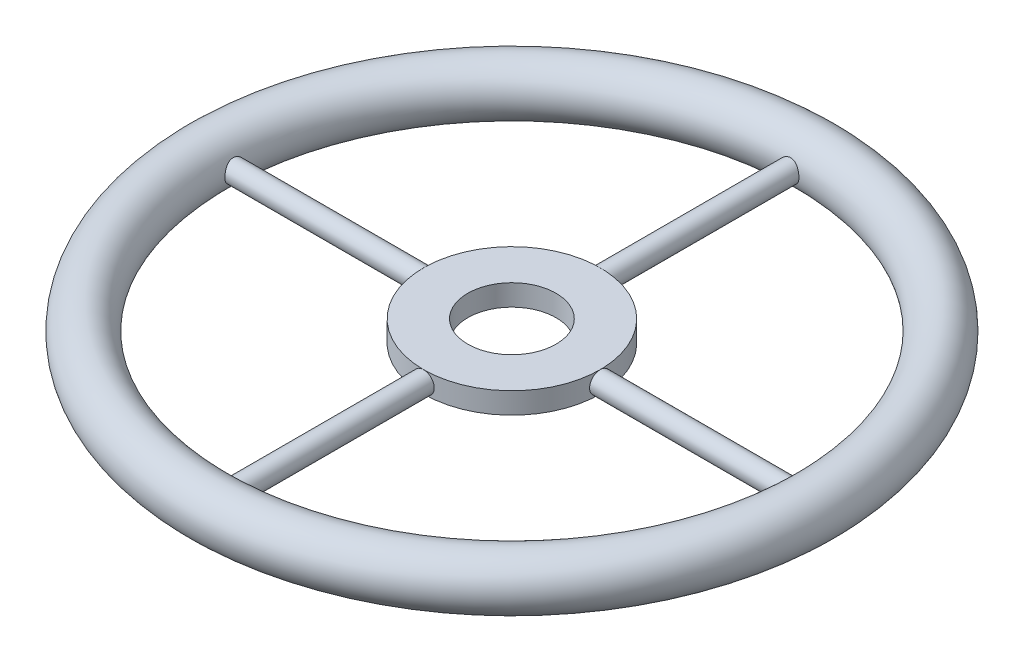
ISO-10303-21;
HEADER;
FILE_DESCRIPTION(('STEP AP214'),'2;1');
FILE_NAME('part.step','',(''),(''),'','','');
FILE_SCHEMA(('AUTOMOTIVE_DESIGN { 1 0 10303 214 1 1 1 1 }'));
ENDSEC;
DATA;
#1=APPLICATION_CONTEXT('core data for automotive mechanical design processes');
#2=APPLICATION_PROTOCOL_DEFINITION('international standard','automotive_design',2000,#1);
#3=PRODUCT_CONTEXT('',#1,'mechanical');
#4=PRODUCT('Part','Part','',(#3));
#5=PRODUCT_RELATED_PRODUCT_CATEGORY('part','',(#4));
#6=PRODUCT_DEFINITION_FORMATION('','',#4);
#7=PRODUCT_DEFINITION_CONTEXT('part definition',#1,'design');
#8=PRODUCT_DEFINITION('design','',#6,#7);
#9=PRODUCT_DEFINITION_SHAPE('','',#8);
#10=(LENGTH_UNIT() NAMED_UNIT(*) SI_UNIT(.MILLI.,.METRE.));
#11=(NAMED_UNIT(*) PLANE_ANGLE_UNIT() SI_UNIT($,.RADIAN.));
#12=(NAMED_UNIT(*) SI_UNIT($,.STERADIAN.) SOLID_ANGLE_UNIT());
#13=UNCERTAINTY_MEASURE_WITH_UNIT(LENGTH_MEASURE(1.E-05),#10,'distance_accuracy_value','');
#14=(GEOMETRIC_REPRESENTATION_CONTEXT(3) GLOBAL_UNCERTAINTY_ASSIGNED_CONTEXT((#13)) GLOBAL_UNIT_ASSIGNED_CONTEXT((#10,
#11,#12)) REPRESENTATION_CONTEXT('',''));
#15=CARTESIAN_POINT('',(0.,0.,0.));
#16=DIRECTION('',(0.,0.,1.));
#17=DIRECTION('',(1.,0.,0.));
#18=AXIS2_PLACEMENT_3D('',#15,#16,#17);
#19=CARTESIAN_POINT('',(0.,3.,0.));
#20=DIRECTION('',(0.,1.,0.));
#21=DIRECTION('',(0.,0.,1.));
#22=AXIS2_PLACEMENT_3D('',#19,#20,#21);
#23=PLANE('',#22);
#24=CARTESIAN_POINT('',(0.,3.,0.));
#25=DIRECTION('',(0.,1.,0.));
#26=DIRECTION('',(0.,0.,1.));
#27=AXIS2_PLACEMENT_3D('',#24,#25,#26);
#28=CIRCLE('',#27,25.);
#29=CARTESIAN_POINT('',(0.,3.,25.));
#30=VERTEX_POINT('',#29);
#31=EDGE_CURVE('E11',#30,#30,#28,.T.);
#32=ORIENTED_EDGE('',*,*,#31,.T.);
#33=EDGE_LOOP('',(#32));
#34=FACE_BOUND('',#33,.T.);
#35=CARTESIAN_POINT('',(0.,3.,0.));
#36=DIRECTION('',(0.,1.,0.));
#37=DIRECTION('',(0.,0.,1.));
#38=AXIS2_PLACEMENT_3D('',#35,#36,#37);
#39=CIRCLE('',#38,12.5);
#40=CARTESIAN_POINT('',(0.,3.,12.5));
#41=VERTEX_POINT('',#40);
#42=EDGE_CURVE('E51',#41,#41,#39,.T.);
#43=ORIENTED_EDGE('',*,*,#42,.F.);
#44=EDGE_LOOP('',(#43));
#45=FACE_BOUND('',#44,.T.);
#46=ADVANCED_FACE('F40',(#34,#45),#23,.T.);
#47=CARTESIAN_POINT('',(0.,-3.,0.));
#48=DIRECTION('',(0.,1.,0.));
#49=DIRECTION('',(0.,0.,1.));
#50=AXIS2_PLACEMENT_3D('',#47,#48,#49);
#51=PLANE('',#50);
#52=CARTESIAN_POINT('',(0.,-3.,0.));
#53=DIRECTION('',(0.,1.,0.));
#54=DIRECTION('',(0.,0.,1.));
#55=AXIS2_PLACEMENT_3D('',#52,#53,#54);
#56=CIRCLE('',#55,25.);
#57=CARTESIAN_POINT('',(0.,-3.,25.));
#58=VERTEX_POINT('',#57);
#59=EDGE_CURVE('E44',#58,#58,#56,.T.);
#60=ORIENTED_EDGE('',*,*,#59,.F.);
#61=EDGE_LOOP('',(#60));
#62=FACE_BOUND('',#61,.T.);
#63=CARTESIAN_POINT('',(0.,-3.,0.));
#64=DIRECTION('',(0.,1.,0.));
#65=DIRECTION('',(0.,0.,1.));
#66=AXIS2_PLACEMENT_3D('',#63,#64,#65);
#67=CIRCLE('',#66,12.5);
#68=CARTESIAN_POINT('',(0.,-3.,12.5));
#69=VERTEX_POINT('',#68);
#70=EDGE_CURVE('E53',#69,#69,#67,.T.);
#71=ORIENTED_EDGE('',*,*,#70,.T.);
#72=EDGE_LOOP('',(#71));
#73=FACE_BOUND('',#72,.T.);
#74=ADVANCED_FACE('F63',(#62,#73),#51,.F.);
#75=CARTESIAN_POINT('',(0.,3.,0.));
#76=DIRECTION('',(0.,-1.,0.));
#77=DIRECTION('',(0.,0.,-1.));
#78=AXIS2_PLACEMENT_3D('',#75,#76,#77);
#79=CYLINDRICAL_SURFACE('',#78,25.);
#80=ORIENTED_EDGE('',*,*,#59,.T.);
#81=EDGE_LOOP('',(#80));
#82=FACE_BOUND('',#81,.T.);
#83=ORIENTED_EDGE('',*,*,#31,.F.);
#84=EDGE_LOOP('',(#83));
#85=FACE_BOUND('',#84,.T.);
#86=ADVANCED_FACE('F42',(#82,#85),#79,.T.);
#87=CARTESIAN_POINT('',(0.,3.,0.));
#88=DIRECTION('',(0.,-1.,0.));
#89=DIRECTION('',(0.,0.,-1.));
#90=AXIS2_PLACEMENT_3D('',#87,#88,#89);
#91=CYLINDRICAL_SURFACE('',#90,12.5);
#92=ORIENTED_EDGE('',*,*,#42,.T.);
#93=EDGE_LOOP('',(#92));
#94=FACE_BOUND('',#93,.T.);
#95=ORIENTED_EDGE('',*,*,#70,.F.);
#96=EDGE_LOOP('',(#95));
#97=FACE_BOUND('',#96,.T.);
#98=ADVANCED_FACE('F59',(#94,#97),#91,.F.);
#99=CLOSED_SHELL('',(#46,#74,#86,#98));
#100=MANIFOLD_SOLID_BREP('B2',#99);
#101=CARTESIAN_POINT('',(0.,0.,0.));
#102=DIRECTION('',(0.,1.,0.));
#103=DIRECTION('',(0.,0.,1.));
#104=AXIS2_PLACEMENT_3D('',#101,#102,#103);
#105=TOROIDAL_SURFACE('',#104,85.8476638283119,7.5);
#106=CARTESIAN_POINT('',(78.5618686561057,-1.91339077582563,-2.3106142137616));
#107=CARTESIAN_POINT('',(78.5995124751979,-2.04393674965702,-2.2024992142221));
#108=CARTESIAN_POINT('',(78.638591819974,-2.16522498624866,-2.08338323229612));
#109=CARTESIAN_POINT('',(78.7154383525312,-2.38641971132747,-1.82590455223503));
#110=CARTESIAN_POINT('',(78.7532018439047,-2.48626948787211,-1.68749236447009));
#111=CARTESIAN_POINT('',(78.8230692540053,-2.661765396633,-1.39434747518503));
#112=CARTESIAN_POINT('',(78.8551631593777,-2.73736889444155,-1.23958665455772));
#113=CARTESIAN_POINT('',(78.9094082721015,-2.86127809993714,-0.91799346306707));
#114=CARTESIAN_POINT('',(78.9315722924355,-2.90961900676459,-0.75117697302815));
#115=CARTESIAN_POINT('',(78.9618888732425,-2.97496781791361,-0.420033006944285));
#116=CARTESIAN_POINT('',(78.9707564121175,-2.99357842037604,-0.256089062158436));
#117=CARTESIAN_POINT('',(78.9755161780428,-3.0036216625241,0.0728101053366255));
#118=CARTESIAN_POINT('',(78.9714115757815,-2.99506094350034,0.237765071092576));
#119=CARTESIAN_POINT('',(78.9515515818405,-2.95274266632924,0.552016400852583));
#120=CARTESIAN_POINT('',(78.9366160840533,-2.92075677724214,0.701609910119406));
#121=CARTESIAN_POINT('',(78.897818935931,-2.83491864760548,0.993146830242615));
#122=CARTESIAN_POINT('',(78.8739554044755,-2.78106179868006,1.13508862168012));
#123=CARTESIAN_POINT('',(78.8187214075257,-2.6505394203824,1.41397963718226));
#124=CARTESIAN_POINT('',(78.7870779631489,-2.57301165123146,1.55046945511017));
#125=CARTESIAN_POINT('',(78.7201390313756,-2.39819070750078,1.80916551437246));
#126=CARTESIAN_POINT('',(78.6848418779664,-2.30088849654865,1.93136518514014));
#127=CARTESIAN_POINT('',(78.6108015989089,-2.0792230837355,2.16922113311402));
#128=CARTESIAN_POINT('',(78.5720283296728,-1.95323288376062,2.28335770455394));
#129=CARTESIAN_POINT('',(78.4982384949839,-1.68306791658934,2.48920098955542));
#130=CARTESIAN_POINT('',(78.4632224234013,-1.53889076418863,2.58090475642738));
#131=CARTESIAN_POINT('',(78.4005212335877,-1.23451407238422,2.73964287062057));
#132=CARTESIAN_POINT('',(78.3728950986675,-1.07419890484202,2.80648030570281));
#133=CARTESIAN_POINT('',(78.328626248943,-0.743073509781658,2.91169431878434));
#134=CARTESIAN_POINT('',(78.3119761191103,-0.572270452983933,2.95009011319498));
#135=CARTESIAN_POINT('',(78.2924983955039,-0.238924403694177,2.99483497718549));
#136=CARTESIAN_POINT('',(78.2887228081595,-0.0767303151223625,3.00338308866935));
#137=CARTESIAN_POINT('',(78.2927466810367,0.246747681492072,2.99420760268051));
#138=CARTESIAN_POINT('',(78.3005437925712,0.408031767552397,2.97648933598755));
#139=CARTESIAN_POINT('',(78.3262761523617,0.71806209147178,2.91689312606649));
#140=CARTESIAN_POINT('',(78.3437697827291,0.867050215003399,2.87606604434791));
#141=CARTESIAN_POINT('',(78.3868481885834,1.15597944373606,2.77259317752849));
#142=CARTESIAN_POINT('',(78.4124344351102,1.29591889853564,2.70994342538961));
#143=CARTESIAN_POINT('',(78.4707078196434,1.57009820581867,2.56129917872123));
#144=CARTESIAN_POINT('',(78.5036739417856,1.70375394084042,2.47433931917144));
#145=CARTESIAN_POINT('',(78.5727981220403,1.95519058047933,2.28088149722203));
#146=CARTESIAN_POINT('',(78.6089577560932,2.07296357399083,2.17437386008152));
#147=CARTESIAN_POINT('',(78.6838264320591,2.29855737396736,1.93536420012576));
#148=CARTESIAN_POINT('',(78.7225213135003,2.4049504897437,1.80150495178622));
#149=CARTESIAN_POINT('',(78.7953378256346,2.59395906161232,1.51676316531546));
#150=CARTESIAN_POINT('',(78.8294592062043,2.67657321752332,1.36587969696493));
#151=CARTESIAN_POINT('',(78.888775324316,2.81507485256404,1.05110226981276));
#152=CARTESIAN_POINT('',(78.913994688711,2.87103621733115,0.887245764354306));
#153=CARTESIAN_POINT('',(78.9520236447146,2.95402789382665,0.551026881729346));
#154=CARTESIAN_POINT('',(78.9648443142742,2.98108403398154,0.378672242455212));
#155=CARTESIAN_POINT('',(78.9756107357453,3.00383269863051,0.0467718495112792));
#156=CARTESIAN_POINT('',(78.9747682501717,3.00208002665547,-0.112563515325449));
#157=CARTESIAN_POINT('',(78.9612649877136,2.97347975748081,-0.428440427864999));
#158=CARTESIAN_POINT('',(78.9486045632573,2.94663290862612,-0.58498205873917));
#159=CARTESIAN_POINT('',(78.9136932868741,2.87030746497312,-0.88580984417429));
#160=CARTESIAN_POINT('',(78.891764570547,2.82158590947409,-1.03032835755258));
#161=CARTESIAN_POINT('',(78.8408248291199,2.70346297550031,-1.30929443868641));
#162=CARTESIAN_POINT('',(78.8118117181834,2.63405550520526,-1.44373902514323));
#163=CARTESIAN_POINT('',(78.7472421043279,2.47053292600287,-1.70956128675353));
#164=CARTESIAN_POINT('',(78.7113590631349,2.37496177289715,-1.83996338490581));
#165=CARTESIAN_POINT('',(78.6383918883654,2.16434973148672,-2.08363841502114));
#166=CARTESIAN_POINT('',(78.6013071804828,2.04929941923749,-2.19690300545561));
#167=CARTESIAN_POINT('',(78.5270434670328,1.79345436307324,-2.41106470011811));
#168=CARTESIAN_POINT('',(78.490036677455,1.65142679520605,-2.51055716100987));
#169=CARTESIAN_POINT('',(78.4229073232578,1.35110844063152,-2.6841307189476));
#170=CARTESIAN_POINT('',(78.392783048118,1.19282170904284,-2.75821813224132));
#171=CARTESIAN_POINT('',(78.3437700652401,0.869629144271727,-2.87617000365357));
#172=CARTESIAN_POINT('',(78.3245475868581,0.705106412691055,-2.92093964009821));
#173=CARTESIAN_POINT('',(78.2981586179533,0.369961173572077,-2.98196047298577));
#174=CARTESIAN_POINT('',(78.2909837032634,0.199343013543308,-2.99823159713927));
#175=CARTESIAN_POINT('',(78.2896041546164,-0.128970389126099,-3.00136983028685));
#176=CARTESIAN_POINT('',(78.2944402517421,-0.286645603629565,-2.99041159856704));
#177=CARTESIAN_POINT('',(78.314582685326,-0.597736743870893,-2.94405281385859));
#178=CARTESIAN_POINT('',(78.3298939975215,-0.751150609411467,-2.90864064515156));
#179=CARTESIAN_POINT('',(78.3692630588409,-1.04835418381051,-2.81515035211971));
#180=CARTESIAN_POINT('',(78.3932544648431,-1.19220734931058,-2.75724391353834));
#181=CARTESIAN_POINT('',(78.4476928685678,-1.46812046058587,-2.62073489704594));
#182=CARTESIAN_POINT('',(78.4781286367383,-1.60020036008252,-2.54216826344566));
#183=CARTESIAN_POINT('',(78.5271275525521,-1.78982535990857,-2.4089015514564));
#184=CARTESIAN_POINT('',(78.5443425199543,-1.85261143497863,-2.36095018518092));
#185=CARTESIAN_POINT('',(78.5618686561057,-1.91339077582563,-2.3106142137616));
#186=B_SPLINE_CURVE_WITH_KNOTS('',3,(#106,#107,#108,#109,#110,#111,#112,#113,#114,#115,#116,
#117,#118,#119,#120,#121,#122,#123,#124,#125,#126,#127,#128,#129,#130,#131,#132,#133,#134,#135,
#136,#137,#138,#139,#140,#141,#142,#143,#144,#145,#146,#147,#148,#149,#150,#151,#152,#153,#154,
#155,#156,#157,#158,#159,#160,#161,#162,#163,#164,#165,#166,#167,#168,#169,#170,#171,#172,#173,
#174,#175,#176,#177,#178,#179,#180,#181,#182,#183,#184,#185),.UNSPECIFIED.,.T.,.F.,(4,2,2,2,2,2,
2,2,2,2,2,2,2,2,2,2,2,2,2,2,2,2,2,2,2,2,2,2,2,2,2,2,2,2,2,2,2,2,2,4),(0.,0.520667334552099,
1.04269548755042,1.56563659960743,2.08790097968811,2.58092566555643,3.07382985422919,
3.5328669971611,3.99200091290158,4.47040034270268,4.94901888136745,5.46971442257616,
5.99047832372723,6.51528246186012,7.03973169523005,7.52461737971955,8.00940466979305,
8.47373828691227,8.93815635709032,9.424576723299,9.91123848492748,10.4347302617316,
10.9582506564809,11.4803112009613,12.001904864123,12.4775134075935,12.9531077681764,
13.4133789866484,13.8737858851126,14.3685108535881,14.8634758556807,15.3928058196497,
15.9220040850891,16.43397867761,16.9455951264944,17.4176835336181,17.8899963390213,
18.3587729242251,18.8267392733815,19.0691505593513),.UNSPECIFIED.);
#187=CARTESIAN_POINT('',(78.5618686561057,-1.91339077582563,-2.3106142137616));
#188=VERTEX_POINT('',#187);
#189=EDGE_CURVE('E120',#188,#188,#186,.T.);
#190=ORIENTED_EDGE('',*,*,#189,.F.);
#191=EDGE_LOOP('',(#190));
#192=FACE_BOUND('',#191,.T.);
#193=CARTESIAN_POINT('',(-2.51316678519638,-1.63829327725293,-78.4885574861029));
#194=CARTESIAN_POINT('',(-2.41934447941206,-1.78220149518015,-78.5237965211951));
#195=CARTESIAN_POINT('',(-2.31332251364395,-1.91775759379407,-78.5618651726387));
#196=CARTESIAN_POINT('',(-2.07976672415185,-2.16889966871946,-78.6395152614662));
#197=CARTESIAN_POINT('',(-1.95217006165346,-2.28442525367376,-78.6791008488618));
#198=CARTESIAN_POINT('',(-1.67850465366882,-2.49241482169713,-78.755303328163));
#199=CARTESIAN_POINT('',(-1.53243410859537,-2.58487655544705,-78.7919199302814));
#200=CARTESIAN_POINT('',(-1.22535107106869,-2.74378378131106,-78.8576844150814));
#201=CARTESIAN_POINT('',(-1.06435548554183,-2.8102582765558,-78.8868406113373));
#202=CARTESIAN_POINT('',(-0.737367544923731,-2.91283796032252,-78.932916406295));
#203=CARTESIAN_POINT('',(-0.571732070160122,-2.94990028521982,-78.9502189098082));
#204=CARTESIAN_POINT('',(-0.23576196369973,-2.99551420262397,-78.9716229316137));
#205=CARTESIAN_POINT('',(-0.0654300057831522,-3.0040816930326,-78.9757318108781));
#206=CARTESIAN_POINT('',(0.259181179223377,-2.99280680438401,-78.9703927467513));
#207=CARTESIAN_POINT('',(0.413570065983336,-2.97536663994517,-78.9620909539538));
#208=CARTESIAN_POINT('',(0.716925754373804,-2.9171692488975,-78.9350598107687));
#209=CARTESIAN_POINT('',(0.865891873569792,-2.87640909827353,-78.9163291527484));
#210=CARTESIAN_POINT('',(1.15550493170679,-2.77283473905363,-78.8705106175926));
#211=CARTESIAN_POINT('',(1.29609898960417,-2.7098948079036,-78.8433752079038));
#212=CARTESIAN_POINT('',(1.56517031682369,-2.56392145464633,-78.7836615419636));
#213=CARTESIAN_POINT('',(1.6936430297575,-2.48088051810469,-78.7510812516453));
#214=CARTESIAN_POINT('',(1.94687026494002,-2.28848456240687,-78.6805839458493));
#215=CARTESIAN_POINT('',(2.07029255438067,-2.17745248850622,-78.6424497578921));
#216=CARTESIAN_POINT('',(2.29739214974499,-1.93634506772528,-78.5673540563915));
#217=CARTESIAN_POINT('',(2.40106198001149,-1.80626254368692,-78.5303929912296));
#218=CARTESIAN_POINT('',(2.58985856998974,-1.52401647626695,-78.4599834007081));
#219=CARTESIAN_POINT('',(2.67403309964303,-1.37115888539858,-78.426745307474));
#220=CARTESIAN_POINT('',(2.81502056050331,-1.0517092417274,-78.3695021501368));
#221=CARTESIAN_POINT('',(2.87184840756917,-0.885124734284904,-78.3454920541959));
#222=CARTESIAN_POINT('',(2.95313235702873,-0.553523603478211,-78.3107234787314));
#223=CARTESIAN_POINT('',(2.97931674035858,-0.389005831217838,-78.2992601713255));
#224=CARTESIAN_POINT('',(3.00404350235043,-0.0575366961014114,-78.288442478134));
#225=CARTESIAN_POINT('',(3.00259727310298,0.109413635442545,-78.2890831019012));
#226=CARTESIAN_POINT('',(2.97315646041706,0.429547026796903,-78.3019462541287));
#227=CARTESIAN_POINT('',(2.94688128128732,0.582923224209778,-78.3134186400802));
#228=CARTESIAN_POINT('',(2.87132351116778,0.882850631067848,-78.3456925301844));
#229=CARTESIAN_POINT('',(2.82203859737128,1.02940114982552,-78.3664949761879));
#230=CARTESIAN_POINT('',(2.70090755214084,1.31518347517888,-78.4159535657125));
#231=CARTESIAN_POINT('',(2.6286020099661,1.45419209753423,-78.4447679694802));
#232=CARTESIAN_POINT('',(2.46392125270651,1.71853651301957,-78.507344030775));
#233=CARTESIAN_POINT('',(2.37153815956781,1.84386690999086,-78.5411076285752));
#234=CARTESIAN_POINT('',(2.16092951216544,2.08765730742882,-78.6132663274297));
#235=CARTESIAN_POINT('',(2.0412495538534,2.20481716985861,-78.6518172260905));
#236=CARTESIAN_POINT('',(1.78371301205349,2.41791593705496,-78.7271257928175));
#237=CARTESIAN_POINT('',(1.64584947579479,2.51384668678143,-78.7638827675466));
#238=CARTESIAN_POINT('',(1.35035826291033,2.68449585363785,-78.8325270525737));
#239=CARTESIAN_POINT('',(1.19224975205703,2.75846296552496,-78.8642276761683));
#240=CARTESIAN_POINT('',(0.8640521542888,2.87816923443092,-78.9170400182154));
#241=CARTESIAN_POINT('',(0.693972842343499,2.92393113168466,-78.9381602644358));
#242=CARTESIAN_POINT('',(0.359952357987858,2.98279433170927,-78.9655907045896));
#243=CARTESIAN_POINT('',(0.196468400489751,2.99803452764327,-78.9728688212407));
#244=CARTESIAN_POINT('',(-0.130834832247803,3.00160648232699,-78.9745614436406));
#245=CARTESIAN_POINT('',(-0.294653983245081,2.98994686242589,-78.9689800708366));
#246=CARTESIAN_POINT('',(-0.606888450574964,2.94194385046449,-78.9465221501434));
#247=CARTESIAN_POINT('',(-0.755616162439587,2.90723934291152,-78.9303965691774));
#248=CARTESIAN_POINT('',(-1.04502368929418,2.81619460276913,-78.8895121660863));
#249=CARTESIAN_POINT('',(-1.18570158086365,2.75984922391741,-78.8647512905921));
#250=CARTESIAN_POINT('',(-1.46254686276419,2.62409296421099,-78.807867689752));
#251=CARTESIAN_POINT('',(-1.5981707580236,2.54370195198809,-78.7754478524046));
#252=CARTESIAN_POINT('',(-1.85469706985101,2.36320173397362,-78.7073254402899));
#253=CARTESIAN_POINT('',(-1.97559253500699,2.26308327527062,-78.6716213292812));
#254=CARTESIAN_POINT('',(-2.21006331210765,2.03580788257117,-78.5972258540164));
#255=CARTESIAN_POINT('',(-2.32210961874531,1.90706425982536,-78.5585422522192));
#256=CARTESIAN_POINT('',(-2.52326591955725,1.6316270084148,-78.4854408927282));
#257=CARTESIAN_POINT('',(-2.6123739921642,1.48493187744528,-78.4510234925451));
#258=CARTESIAN_POINT('',(-2.76485561377178,1.17690992030671,-78.3902226130333));
#259=CARTESIAN_POINT('',(-2.82820179712913,1.01556775658959,-78.3638476842437));
#260=CARTESIAN_POINT('',(-2.92632478816194,0.683085785904512,-78.3223350701928));
#261=CARTESIAN_POINT('',(-2.96112380316935,0.511953705761074,-78.3071886509665));
#262=CARTESIAN_POINT('',(-2.99897368611926,0.178998970505346,-78.290676253763));
#263=CARTESIAN_POINT('',(-3.00426746982166,0.0174771294475448,-78.2883369756048));
#264=CARTESIAN_POINT('',(-2.98888014493491,-0.304150566519671,-78.29508001353));
#265=CARTESIAN_POINT('',(-2.96819043279889,-0.464255934731789,-78.304166112738));
#266=CARTESIAN_POINT('',(-2.90298273107405,-0.772415645468404,-78.332230655788));
#267=CARTESIAN_POINT('',(-2.85935780529746,-0.92069648489186,-78.3508376871362));
#268=CARTESIAN_POINT('',(-2.75050167046188,-1.20756028007291,-78.3958857117216));
#269=CARTESIAN_POINT('',(-2.68531109421621,-1.34616088448301,-78.4223119626052));
#270=CARTESIAN_POINT('',(-2.57962121423259,-1.53280252221526,-78.4633670964977));
#271=CARTESIAN_POINT('',(-2.54719645530091,-1.58609727609461,-78.4757761679615));
#272=CARTESIAN_POINT('',(-2.51316678519638,-1.63829327725293,-78.4885574861029));
#273=B_SPLINE_CURVE_WITH_KNOTS('',3,(#193,#194,#195,#196,#197,#198,#199,#200,#201,#202,#203,
#204,#205,#206,#207,#208,#209,#210,#211,#212,#213,#214,#215,#216,#217,#218,#219,#220,#221,#222,
#223,#224,#225,#226,#227,#228,#229,#230,#231,#232,#233,#234,#235,#236,#237,#238,#239,#240,#241,
#242,#243,#244,#245,#246,#247,#248,#249,#250,#251,#252,#253,#254,#255,#256,#257,#258,#259,#260,
#261,#262,#263,#264,#265,#266,#267,#268,#269,#270,#271,#272),.UNSPECIFIED.,.T.,.F.,(4,2,2,2,2,2,
2,2,2,2,2,2,2,2,2,2,2,2,2,2,2,2,2,2,2,2,2,2,2,2,2,2,2,2,2,2,2,2,2,4),(0.,0.525931714481577,
1.05342251877902,1.58096474691214,2.10791651766461,2.61692288536075,3.12564521940462,
3.59019557471919,4.05480419122036,4.52208988978738,4.98955054604103,5.49832742021949,
6.00729646890678,6.53746544143898,7.06734491216286,7.56562728343875,8.06370421752682,
8.52963620917513,8.99561524630473,9.47154735315971,9.94766654508815,10.4609543242387,
10.9744389389408,11.503870562753,12.0328747761561,12.5232915117581,13.0135510913944,
13.4722212362709,13.9310005218464,14.4118741873982,14.8929739399252,15.4155393933306,
15.9381486085257,16.4613115259289,16.9840670789596,17.4664786794766,17.9490500562354,
18.4140881902167,18.8782550684609,19.0690122939598),.UNSPECIFIED.);
#274=CARTESIAN_POINT('',(-2.51316678519638,-1.63829327725293,-78.4885574861029));
#275=VERTEX_POINT('',#274);
#276=EDGE_CURVE('E116',#275,#275,#273,.T.);
#277=ORIENTED_EDGE('',*,*,#276,.F.);
#278=EDGE_LOOP('',(#277));
#279=FACE_BOUND('',#278,.T.);
#280=CARTESIAN_POINT('',(-78.6155819953854,-2.09088683587358,-2.15132336936375));
#281=CARTESIAN_POINT('',(-78.5780371980814,-1.97244142081155,-2.26643620755404));
#282=CARTESIAN_POINT('',(-78.5408500042305,-1.84425495838283,-2.37196734481115));
#283=CARTESIAN_POINT('',(-78.4710144930271,-1.57116615761471,-2.56107419248363));
#284=CARTESIAN_POINT('',(-78.4383755107404,-1.42623052514743,-2.64460505170207));
#285=CARTESIAN_POINT('',(-78.3810706002371,-1.12271206392254,-2.78705138767694));
#286=CARTESIAN_POINT('',(-78.3564245583476,-0.964096420753614,-2.84590557403603));
#287=CARTESIAN_POINT('',(-78.318055579965,-0.638087879793802,-2.93622254124496));
#288=CARTESIAN_POINT('',(-78.304321739104,-0.47070392281499,-2.96771266946609));
#289=CARTESIAN_POINT('',(-78.2898211666012,-0.142149887659176,-3.00091393134429));
#290=CARTESIAN_POINT('',(-78.2883582877866,0.0188286927911054,-3.00422393068592));
#291=CARTESIAN_POINT('',(-78.2967338921289,0.338947245462036,-2.98509960192841));
#292=CARTESIAN_POINT('',(-78.306572152325,0.498087253893409,-2.96266578173052));
#293=CARTESIAN_POINT('',(-78.3359772701106,0.804656556304654,-2.89420068477071));
#294=CARTESIAN_POINT('',(-78.3552132003965,0.952298902763375,-2.84897054814863));
#295=CARTESIAN_POINT('',(-78.4013762506453,1.23787970861642,-2.73700453738786));
#296=CARTESIAN_POINT('',(-78.428304849293,1.37581629601043,-2.67026452830479));
#297=CARTESIAN_POINT('',(-78.4890194654231,1.64625622838428,-2.51308826378013));
#298=CARTESIAN_POINT('',(-78.5230979600474,1.77806034117872,-2.42156409950627));
#299=CARTESIAN_POINT('',(-78.5938488547492,2.02508881103978,-2.21913159721764));
#300=CARTESIAN_POINT('',(-78.6305225896007,2.14030454262861,-2.10821324068412));
#301=CARTESIAN_POINT('',(-78.7056114802511,2.35952360321912,-1.86062531821704));
#302=CARTESIAN_POINT('',(-78.7439596555424,2.46210478593379,-1.72267054474648));
#303=CARTESIAN_POINT('',(-78.8151917014203,2.64272743505183,-1.43021511729031));
#304=CARTESIAN_POINT('',(-78.8480759747287,2.72077071042232,-1.27571568412527));
#305=CARTESIAN_POINT('',(-78.90373912305,2.84865438983692,-0.956214059116495));
#306=CARTESIAN_POINT('',(-78.9266514557673,2.89886988340816,-0.791386654947622));
#307=CARTESIAN_POINT('',(-78.9597062695882,2.97037693032635,-0.454382960689919));
#308=CARTESIAN_POINT('',(-78.9698597665239,2.9916934359833,-0.28221314295216));
#309=CARTESIAN_POINT('',(-78.9755797844175,3.00374996975678,0.0479199748160914));
#310=CARTESIAN_POINT('',(-78.972372062123,2.99705909970012,0.205773609967339));
#311=CARTESIAN_POINT('',(-78.9545405645186,2.95914721969693,0.51783283046471));
#312=CARTESIAN_POINT('',(-78.9399163713497,2.92792531187958,0.672038282069319));
#313=CARTESIAN_POINT('',(-78.9015071430362,2.84318733142186,0.969384427335915));
#314=CARTESIAN_POINT('',(-78.8779196710874,2.79015015323328,1.11268888044745));
#315=CARTESIAN_POINT('',(-78.8241519203015,2.66361081920044,1.38860903603981));
#316=CARTESIAN_POINT('',(-78.7939695542181,2.59010218223005,1.52122133628325));
#317=CARTESIAN_POINT('',(-78.7273731522757,2.41784454055516,1.7834141860043));
#318=CARTESIAN_POINT('',(-78.6906534148162,2.3175435280605,1.91189764383715));
#319=CARTESIAN_POINT('',(-78.6167095644166,2.09757179732199,2.1509531631056));
#320=CARTESIAN_POINT('',(-78.5794852239069,1.97789205388693,2.26151683057633));
#321=CARTESIAN_POINT('',(-78.5059864338482,1.7136409136181,2.46846030740688));
#322=CARTESIAN_POINT('',(-78.469913539324,1.56798705830835,2.56353785919727));
#323=CARTESIAN_POINT('',(-78.4054159102987,1.26110241894206,2.72761066943695));
#324=CARTESIAN_POINT('',(-78.3769884280704,1.09987725953236,2.79661530199773));
#325=CARTESIAN_POINT('',(-78.3321346358819,0.773379141724307,2.90346934777242));
#326=CARTESIAN_POINT('',(-78.315256157012,0.608557425606749,2.94250098145124));
#327=CARTESIAN_POINT('',(-78.2936451609448,0.273944683489632,2.99224333220391));
#328=CARTESIAN_POINT('',(-78.2889059504713,0.104156448157992,3.00296965618652));
#329=CARTESIAN_POINT('',(-78.2920088956053,-0.221985344448091,2.99588619337958));
#330=CARTESIAN_POINT('',(-78.2989400462835,-0.378397421122433,2.98014280616525));
#331=CARTESIAN_POINT('',(-78.3229365255772,-0.686085579367685,2.92467522169512));
#332=CARTESIAN_POINT('',(-78.3400021695338,-0.837361500969046,2.88495027823746));
#333=CARTESIAN_POINT('',(-78.3825724578626,-1.13097391494819,2.78299959283611));
#334=CARTESIAN_POINT('',(-78.4080850611742,-1.27330182521378,2.72075262491598));
#335=CARTESIAN_POINT('',(-78.4651408920116,-1.54576198756636,2.57574425811693));
#336=CARTESIAN_POINT('',(-78.4966860203177,-1.67589037641183,2.49297639089117));
#337=CARTESIAN_POINT('',(-78.5654329979522,-1.93046187380017,2.30226599603499));
#338=CARTESIAN_POINT('',(-78.6028799260453,-2.05379077009583,2.19292375618494));
#339=CARTESIAN_POINT('',(-78.6777468777632,-2.28099717924575,1.95552335715683));
#340=CARTESIAN_POINT('',(-78.7151668783846,-2.38486487807493,1.82745581269939));
#341=CARTESIAN_POINT('',(-78.7878612130967,-2.57538697583125,1.54833587805275));
#342=CARTESIAN_POINT('',(-78.8229309227211,-2.66090329792995,1.39644793991806));
#343=CARTESIAN_POINT('',(-78.8842179046863,-2.80479130051775,1.07866470505305));
#344=CARTESIAN_POINT('',(-78.9104402653118,-2.86317859076039,0.912777528428721));
#345=CARTESIAN_POINT('',(-78.949163833724,-2.94787144392626,0.581140001295727));
#346=CARTESIAN_POINT('',(-78.9623327585762,-2.97574683072678,0.415871296433393));
#347=CARTESIAN_POINT('',(-78.975449933474,-3.00351682329444,0.0825323601456931));
#348=CARTESIAN_POINT('',(-78.9754068627208,-3.0034297980788,-0.0855359595896496));
#349=CARTESIAN_POINT('',(-78.9626779547636,-2.97647394222942,-0.405305704897441));
#350=CARTESIAN_POINT('',(-78.9510085338616,-2.9517582099383,-0.557236895061671));
#351=CARTESIAN_POINT('',(-78.9179714350683,-2.87976358687236,-0.854624835066352));
#352=CARTESIAN_POINT('',(-78.8965971818381,-2.83246939734038,-1.00007712174955));
#353=CARTESIAN_POINT('',(-78.8459238669022,-2.71555424874266,-1.28453432989038));
#354=CARTESIAN_POINT('',(-78.8164397362858,-2.64540378365508,-1.42328654359579));
#355=CARTESIAN_POINT('',(-78.7529257495692,-2.48525339785941,-1.68739778654804));
#356=CARTESIAN_POINT('',(-78.7189033830916,-2.39528602573301,-1.8127782829243));
#357=CARTESIAN_POINT('',(-78.6728619630846,-2.26408971570281,-1.96886739998572));
#358=CARTESIAN_POINT('',(-78.661421308609,-2.23073841126827,-2.00657361267613));
#359=CARTESIAN_POINT('',(-78.6385033605876,-2.16218874665982,-2.08025779872102));
#360=CARTESIAN_POINT('',(-78.6270260655549,-2.12699031061762,-2.11623570097117));
#361=CARTESIAN_POINT('',(-78.6155819953854,-2.09088683587358,-2.15132336936375));
#362=B_SPLINE_CURVE_WITH_KNOTS('',3,(#280,#281,#282,#283,#284,#285,#286,#287,#288,#289,#290,
#291,#292,#293,#294,#295,#296,#297,#298,#299,#300,#301,#302,#303,#304,#305,#306,#307,#308,#309,
#310,#311,#312,#313,#314,#315,#316,#317,#318,#319,#320,#321,#322,#323,#324,#325,#326,#327,#328,
#329,#330,#331,#332,#333,#334,#335,#336,#337,#338,#339,#340,#341,#342,#343,#344,#345,#346,#347,
#348,#349,#350,#351,#352,#353,#354,#355,#356,#357,#358,#359,#360,#361),.UNSPECIFIED.,.T.,.F.,(4,
2,2,2,2,2,2,2,2,2,2,2,2,2,2,2,2,2,2,2,2,2,2,2,2,2,2,2,2,2,2,2,2,2,2,2,2,2,2,2,4),(0.,
0.50795948431378,1.01694664962301,1.52719062254603,2.03692407423963,2.51752924279014,
2.99812492961761,3.46289941129206,3.92776329210448,4.4178123589819,4.9081153239887,
5.43402922200333,5.95990433985127,6.47850718899961,6.99666197407467,7.46837882417827,
7.94011294059299,8.40200163985481,8.86403673653562,9.36314562991995,9.86248764374847,
10.3927503914652,10.9228223096592,11.4307267820862,11.9383511488822,12.4081576303326,
12.8779787308736,13.3482437745867,13.8186572383677,14.3235200000757,14.8286366761822,
15.3593331164036,15.8897238202942,16.391315536495,16.892577748645,17.3535519731986,
17.8148389898857,18.2876788810835,18.7597478646027,18.9145731787899,19.0694048571906),.UNSPECIFIED.);
#363=CARTESIAN_POINT('',(-78.6155819953854,-2.09088683587358,-2.15132336936375));
#364=VERTEX_POINT('',#363);
#365=EDGE_CURVE('E112',#364,#364,#362,.T.);
#366=ORIENTED_EDGE('',*,*,#365,.F.);
#367=EDGE_LOOP('',(#366));
#368=FACE_BOUND('',#367,.T.);
#369=CARTESIAN_POINT('',(-2.64557970127579,-1.41453457423836,78.4376625859352));
#370=CARTESIAN_POINT('',(-2.71943446751988,-1.27639293156475,78.4086306683713));
#371=CARTESIAN_POINT('',(-2.78280388204224,-1.13178804843701,78.3826578500585));
#372=CARTESIAN_POINT('',(-2.886351487624,-0.833072627642555,78.3394133481827));
#373=CARTESIAN_POINT('',(-2.9264982397094,-0.678949514902811,78.3221534642431));
#374=CARTESIAN_POINT('',(-2.98195316101147,-0.36517788867624,78.2981507827213));
#375=CARTESIAN_POINT('',(-2.99722056766386,-0.205520744284922,78.2914252454144));
#376=CARTESIAN_POINT('',(-3.00208429838388,0.114190967523385,78.2892925517279));
#377=CARTESIAN_POINT('',(-2.99169208978434,0.274245325487985,78.2938803393999));
#378=CARTESIAN_POINT('',(-2.94644424887535,0.585149554586484,78.3135467761119));
#379=CARTESIAN_POINT('',(-2.91234302983673,0.73613130243008,78.3283017819774));
#380=CARTESIAN_POINT('',(-2.8218104006109,1.03007492686308,78.3664877437579));
#381=CARTESIAN_POINT('',(-2.76537347470805,1.17303481252085,78.3899208426021));
#382=CARTESIAN_POINT('',(-2.62959558101997,1.45267268213685,78.444241338813));
#383=CARTESIAN_POINT('',(-2.5495000947399,1.58893649571416,78.4753676750399));
#384=CARTESIAN_POINT('',(-2.36953407183897,1.84662792488356,78.5416635084356));
#385=CARTESIAN_POINT('',(-2.26965492701738,1.96804904484822,78.5768347628123));
#386=CARTESIAN_POINT('',(-2.04381799798091,2.20257446191953,78.6507965039815));
#387=CARTESIAN_POINT('',(-1.91643160318562,2.31428574427007,78.6896549258238));
#388=CARTESIAN_POINT('',(-1.64402962003532,2.51511544836302,78.7641233067056));
#389=CARTESIAN_POINT('',(-1.49900998846713,2.6042286739758,78.7997325174284));
#390=CARTESIAN_POINT('',(-1.19251948999289,2.75820303336238,78.8638995239784));
#391=CARTESIAN_POINT('',(-1.03085209781889,2.82271868499534,78.8923550834162));
#392=CARTESIAN_POINT('',(-0.697324121251357,2.92301077781741,78.9375887673776));
#393=CARTESIAN_POINT('',(-0.52547272839232,2.9588127226866,78.9543772528899));
#394=CARTESIAN_POINT('',(-0.19183797936993,2.99817259446271,78.9729016162438));
#395=CARTESIAN_POINT('',(-0.0304024029684012,3.00415948333014,78.9757709006094));
#396=CARTESIAN_POINT('',(0.291065122303085,2.99017575508654,78.9691436648469));
#397=CARTESIAN_POINT('',(0.451097282851048,2.97020912279017,78.9596490430302));
#398=CARTESIAN_POINT('',(0.757251478555774,2.90686075105865,78.9303283696818));
#399=CARTESIAN_POINT('',(0.903671975646987,2.86465751413362,78.9110239079163));
#400=CARTESIAN_POINT('',(1.18737708373214,2.75917692861611,78.8646041005376));
#401=CARTESIAN_POINT('',(1.32465923908275,2.69589394271088,78.8374866657797));
#402=CARTESIAN_POINT('',(1.59572564547893,2.54542688589682,78.7763019697732));
#403=CARTESIAN_POINT('',(1.72873146309111,2.45697817970495,78.7419022773407));
#404=CARTESIAN_POINT('',(1.97876249826222,2.26048814732615,78.6708974648055));
#405=CARTESIAN_POINT('',(2.09577984473491,2.15243723151017,78.6342912711356));
#406=CARTESIAN_POINT('',(2.31998975252509,1.90972149646064,78.5595337841545));
#407=CARTESIAN_POINT('',(2.4256813605486,1.7736303871238,78.5214880630765));
#408=CARTESIAN_POINT('',(2.61275931168544,1.48430079632056,78.4510773585631));
#409=CARTESIAN_POINT('',(2.6941482338279,1.33106413673407,78.4187117724956));
#410=CARTESIAN_POINT('',(2.82853764581327,1.01413317256032,78.3638430106221));
#411=CARTESIAN_POINT('',(2.88200816274923,0.850667663572957,78.3411777852887));
#412=CARTESIAN_POINT('',(2.96029847573099,0.51588025055101,78.3076197818915));
#413=CARTESIAN_POINT('',(2.98513706221546,0.344563575902439,78.2967192832236));
#414=CARTESIAN_POINT('',(3.00418479038962,0.0134930243766799,78.2883737638843));
#415=CARTESIAN_POINT('',(3.00065055784445,-0.146109802104228,78.2899373417359));
#416=CARTESIAN_POINT('',(2.96842859984257,-0.462243722114556,78.3040078810694));
#417=CARTESIAN_POINT('',(2.93974274842591,-0.618775043612572,78.3165140272235));
#418=CARTESIAN_POINT('',(2.85933311264516,-0.920942590715034,78.3507565777034));
#419=CARTESIAN_POINT('',(2.8081307375569,-1.06674286106986,78.372283585335));
#420=CARTESIAN_POINT('',(2.68460641765387,-1.3477629997708,78.4224677840562));
#421=CARTESIAN_POINT('',(2.6122793558134,-1.48298029453211,78.451126702457));
#422=CARTESIAN_POINT('',(2.44340955293878,-1.7481340739643,78.5149376460289));
#423=CARTESIAN_POINT('',(2.34563933464277,-1.87721738284713,78.5503828741254));
#424=CARTESIAN_POINT('',(2.13092961785992,-2.11782084435266,78.6230032746456));
#425=CARTESIAN_POINT('',(2.01397992361565,-2.22933159328669,78.6601793596198));
#426=CARTESIAN_POINT('',(1.7549443949454,-2.43921461599495,78.7350407873712));
#427=CARTESIAN_POINT('',(1.61170209040171,-2.53621390809345,78.7725946185398));
#428=CARTESIAN_POINT('',(1.30943351660882,-2.70467979221488,78.8410213530123));
#429=CARTESIAN_POINT('',(1.15041135479516,-2.77615300641539,78.8718959882656));
#430=CARTESIAN_POINT('',(0.825503723387612,-2.8891612695452,78.9220647102473));
#431=CARTESIAN_POINT('',(0.659947167427985,-2.93149820852466,78.9416663108924));
#432=CARTESIAN_POINT('',(0.323084567536976,-2.98742472430748,78.9677734185041));
#433=CARTESIAN_POINT('',(0.151783061142227,-3.00103647009779,78.9742890245447));
#434=CARTESIAN_POINT('',(-0.175279090557169,-2.99893634764047,78.9732983862497));
#435=CARTESIAN_POINT('',(-0.331066244881086,-2.98572600958728,78.9669882599766));
#436=CARTESIAN_POINT('',(-0.637889146542541,-2.93551756329832,78.9435352984848));
#437=CARTESIAN_POINT('',(-0.788924841132987,-2.89851919108358,78.9263923430529));
#438=CARTESIAN_POINT('',(-1.08155915668928,-2.80247107573649,78.8834600450079));
#439=CARTESIAN_POINT('',(-1.22320237643034,-2.7435358889572,78.857715690094));
#440=CARTESIAN_POINT('',(-1.4950283308639,-2.60540997487824,78.8003027246566));
#441=CARTESIAN_POINT('',(-1.62520117583704,-2.52620199377181,78.7686290740155));
#442=CARTESIAN_POINT('',(-1.88233440972752,-2.3417924850973,78.6995212920514));
#443=CARTESIAN_POINT('',(-2.00803198344712,-2.23492996417566,78.6618257557204));
#444=CARTESIAN_POINT('',(-2.240168762767,-2.00214339435206,78.5869929974981));
#445=CARTESIAN_POINT('',(-2.34664374307124,-1.87625557253259,78.5498548589133));
#446=CARTESIAN_POINT('',(-2.47951182825043,-1.69001429835337,78.5012160774457));
#447=CARTESIAN_POINT('',(-2.51513059632861,-1.63653647070596,78.4878976143694));
#448=CARTESIAN_POINT('',(-2.58295299176392,-1.52724982574514,78.4621004904773));
#449=CARTESIAN_POINT('',(-2.6151559983859,-1.47144058731183,78.4496219824537));
#450=CARTESIAN_POINT('',(-2.64557970127579,-1.41453457423836,78.4376625859352));
#451=B_SPLINE_CURVE_WITH_KNOTS('',3,(#369,#370,#371,#372,#373,#374,#375,#376,#377,#378,#379,
#380,#381,#382,#383,#384,#385,#386,#387,#388,#389,#390,#391,#392,#393,#394,#395,#396,#397,#398,
#399,#400,#401,#402,#403,#404,#405,#406,#407,#408,#409,#410,#411,#412,#413,#414,#415,#416,#417,
#418,#419,#420,#421,#422,#423,#424,#425,#426,#427,#428,#429,#430,#431,#432,#433,#434,#435,#436,
#437,#438,#439,#440,#441,#442,#443,#444,#445,#446,#447,#448,#449,#450),.UNSPECIFIED.,.T.,.F.,(4,
2,2,2,2,2,2,2,2,2,2,2,2,2,2,2,2,2,2,2,2,2,2,2,2,2,2,2,2,2,2,2,2,2,2,2,2,2,2,2,4),(0.,
0.477706459767308,0.956058136750476,1.43519276470295,1.9141133052016,2.37845326597835,
2.84290796531689,3.3241598683224,3.80562163390395,4.32473582385033,4.84396926935168,
5.37024815802469,5.89605908345942,6.37824073515594,6.8603483630786,7.31915168641308,
7.77807780518918,8.26620620188739,8.75457404380308,9.28142782917223,9.8082256843218,
10.325842626563,10.8431196756622,11.3196883574712,11.7962215332988,12.2622574329185,
12.728406314012,13.2235828660698,13.7190235110293,14.2475197082974,14.7758786991248,
15.2890423595113,15.8018098350895,16.2689496366192,16.7360946221508,17.2008335922766,
17.6659694162218,18.1715370315428,18.6761538234961,18.872904337825,19.0696905459421),.UNSPECIFIED.);
#452=CARTESIAN_POINT('',(-2.64557970127579,-1.41453457423836,78.4376625859352));
#453=VERTEX_POINT('',#452);
#454=EDGE_CURVE('E39',#453,#453,#451,.T.);
#455=ORIENTED_EDGE('',*,*,#454,.F.);
#456=EDGE_LOOP('',(#455));
#457=FACE_BOUND('',#456,.T.);
#458=ADVANCED_FACE('F101',(#192,#279,#368,#457),#105,.T.);
#459=CARTESIAN_POINT('',(85.,0.,0.));
#460=DIRECTION('',(-1.,0.,0.));
#461=DIRECTION('',(0.,0.,1.));
#462=AXIS2_PLACEMENT_3D('',#459,#460,#461);
#463=CYLINDRICAL_SURFACE('',#462,3.);
#464=CARTESIAN_POINT('',(25.,0.,0.));
#465=DIRECTION('',(1.,0.,0.));
#466=DIRECTION('',(0.,0.,-1.));
#467=AXIS2_PLACEMENT_3D('',#464,#465,#466);
#468=CIRCLE('',#467,3.);
#469=CARTESIAN_POINT('',(25.,0.,-3.));
#470=VERTEX_POINT('',#469);
#471=EDGE_CURVE('E158',#470,#470,#468,.T.);
#472=ORIENTED_EDGE('',*,*,#471,.T.);
#473=EDGE_LOOP('',(#472));
#474=FACE_BOUND('',#473,.T.);
#475=ORIENTED_EDGE('',*,*,#189,.T.);
#476=EDGE_LOOP('',(#475));
#477=FACE_BOUND('',#476,.T.);
#478=ADVANCED_FACE('F148',(#474,#477),#463,.T.);
#479=CARTESIAN_POINT('',(25.,0.,0.));
#480=DIRECTION('',(1.,0.,0.));
#481=DIRECTION('',(0.,0.,-1.));
#482=AXIS2_PLACEMENT_3D('',#479,#480,#481);
#483=PLANE('',#482);
#484=ORIENTED_EDGE('',*,*,#471,.F.);
#485=EDGE_LOOP('',(#484));
#486=FACE_BOUND('',#485,.T.);
#487=ADVANCED_FACE('F145',(#486),#483,.F.);
#488=CARTESIAN_POINT('',(-2.96775913801666E-13,0.,-85.));
#489=DIRECTION('',(0.,0.,1.));
#490=DIRECTION('',(1.,0.,0.));
#491=AXIS2_PLACEMENT_3D('',#488,#489,#490);
#492=CYLINDRICAL_SURFACE('',#491,3.);
#493=CARTESIAN_POINT('',(0.,0.,-25.));
#494=DIRECTION('',(0.,0.,-1.));
#495=DIRECTION('',(-1.,0.,0.));
#496=AXIS2_PLACEMENT_3D('',#493,#494,#495);
#497=CIRCLE('',#496,3.);
#498=CARTESIAN_POINT('',(-3.00000000000009,0.,-25.));
#499=VERTEX_POINT('',#498);
#500=EDGE_CURVE('E161',#499,#499,#497,.T.);
#501=ORIENTED_EDGE('',*,*,#500,.T.);
#502=EDGE_LOOP('',(#501));
#503=FACE_BOUND('',#502,.T.);
#504=ORIENTED_EDGE('',*,*,#276,.T.);
#505=EDGE_LOOP('',(#504));
#506=FACE_BOUND('',#505,.T.);
#507=ADVANCED_FACE('F140',(#503,#506),#492,.T.);
#508=CARTESIAN_POINT('',(0.,0.,-25.));
#509=DIRECTION('',(0.,0.,-1.));
#510=DIRECTION('',(-1.,0.,0.));
#511=AXIS2_PLACEMENT_3D('',#508,#509,#510);
#512=PLANE('',#511);
#513=ORIENTED_EDGE('',*,*,#500,.F.);
#514=EDGE_LOOP('',(#513));
#515=FACE_BOUND('',#514,.T.);
#516=ADVANCED_FACE('F137',(#515),#512,.F.);
#517=CARTESIAN_POINT('',(-85.,0.,0.));
#518=DIRECTION('',(1.,0.,0.));
#519=DIRECTION('',(0.,0.,-1.));
#520=AXIS2_PLACEMENT_3D('',#517,#518,#519);
#521=CYLINDRICAL_SURFACE('',#520,3.);
#522=CARTESIAN_POINT('',(-25.,0.,0.));
#523=DIRECTION('',(-1.,0.,0.));
#524=DIRECTION('',(0.,0.,1.));
#525=AXIS2_PLACEMENT_3D('',#522,#523,#524);
#526=CIRCLE('',#525,3.);
#527=CARTESIAN_POINT('',(-25.,0.,3.));
#528=VERTEX_POINT('',#527);
#529=EDGE_CURVE('E164',#528,#528,#526,.T.);
#530=ORIENTED_EDGE('',*,*,#529,.T.);
#531=EDGE_LOOP('',(#530));
#532=FACE_BOUND('',#531,.T.);
#533=ORIENTED_EDGE('',*,*,#365,.T.);
#534=EDGE_LOOP('',(#533));
#535=FACE_BOUND('',#534,.T.);
#536=ADVANCED_FACE('F131',(#532,#535),#521,.T.);
#537=CARTESIAN_POINT('',(-25.,0.,0.));
#538=DIRECTION('',(-1.,0.,0.));
#539=DIRECTION('',(0.,0.,1.));
#540=AXIS2_PLACEMENT_3D('',#537,#538,#539);
#541=PLANE('',#540);
#542=ORIENTED_EDGE('',*,*,#529,.F.);
#543=EDGE_LOOP('',(#542));
#544=FACE_BOUND('',#543,.T.);
#545=ADVANCED_FACE('F136',(#544),#541,.F.);
#546=CARTESIAN_POINT('',(8.90327741404999E-13,0.,85.));
#547=DIRECTION('',(0.,0.,-1.));
#548=DIRECTION('',(-1.,0.,0.));
#549=AXIS2_PLACEMENT_3D('',#546,#547,#548);
#550=CYLINDRICAL_SURFACE('',#549,3.);
#551=CARTESIAN_POINT('',(2.61861100413235E-13,0.,25.));
#552=DIRECTION('',(0.,0.,1.));
#553=DIRECTION('',(1.,0.,0.));
#554=AXIS2_PLACEMENT_3D('',#551,#552,#553);
#555=CIRCLE('',#554,3.);
#556=CARTESIAN_POINT('',(3.00000000000026,0.,25.));
#557=VERTEX_POINT('',#556);
#558=EDGE_CURVE('E167',#557,#557,#555,.T.);
#559=ORIENTED_EDGE('',*,*,#558,.T.);
#560=EDGE_LOOP('',(#559));
#561=FACE_BOUND('',#560,.T.);
#562=ORIENTED_EDGE('',*,*,#454,.T.);
#563=EDGE_LOOP('',(#562));
#564=FACE_BOUND('',#563,.T.);
#565=ADVANCED_FACE('F171',(#561,#564),#550,.T.);
#566=CARTESIAN_POINT('',(2.61861100413235E-13,0.,25.));
#567=DIRECTION('',(0.,0.,1.));
#568=DIRECTION('',(1.,0.,0.));
#569=AXIS2_PLACEMENT_3D('',#566,#567,#568);
#570=PLANE('',#569);
#571=ORIENTED_EDGE('',*,*,#558,.F.);
#572=EDGE_LOOP('',(#571));
#573=FACE_BOUND('',#572,.T.);
#574=ADVANCED_FACE('F173',(#573),#570,.F.);
#575=CLOSED_SHELL('',(#458,#478,#487,#507,#516,#536,#545,#565,#574));
#576=MANIFOLD_SOLID_BREP('B6',#575);
#577=ADVANCED_BREP_SHAPE_REPRESENTATION('',(#18,#100,#576),#14);
#578=SHAPE_DEFINITION_REPRESENTATION(#9,#577);
ENDSEC;
END-ISO-10303-21;
